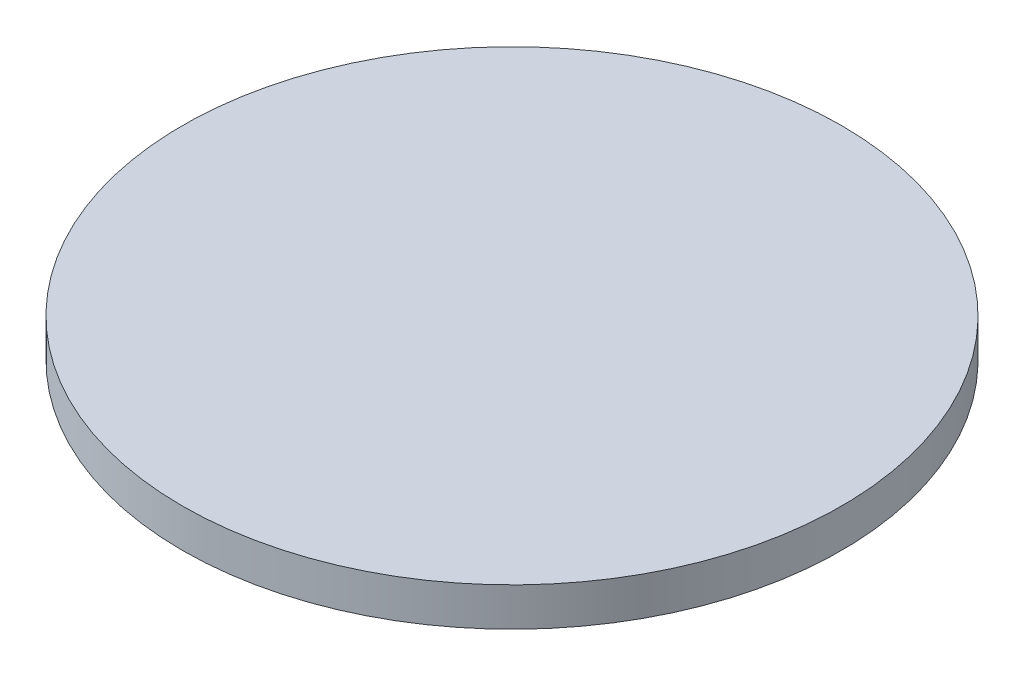
ISO-10303-21;
HEADER;
FILE_DESCRIPTION(('STEP AP214'),'2;1');
FILE_NAME('part.step','',(''),(''),'','','');
FILE_SCHEMA(('AUTOMOTIVE_DESIGN { 1 0 10303 214 1 1 1 1 }'));
ENDSEC;
DATA;
#1=APPLICATION_CONTEXT('core data for automotive mechanical design processes');
#2=APPLICATION_PROTOCOL_DEFINITION('international standard','automotive_design',2000,#1);
#3=PRODUCT_CONTEXT('',#1,'mechanical');
#4=PRODUCT('Part','Part','',(#3));
#5=PRODUCT_RELATED_PRODUCT_CATEGORY('part','',(#4));
#6=PRODUCT_DEFINITION_FORMATION('','',#4);
#7=PRODUCT_DEFINITION_CONTEXT('part definition',#1,'design');
#8=PRODUCT_DEFINITION('design','',#6,#7);
#9=PRODUCT_DEFINITION_SHAPE('','',#8);
#10=(LENGTH_UNIT() NAMED_UNIT(*) SI_UNIT(.MILLI.,.METRE.));
#11=(NAMED_UNIT(*) PLANE_ANGLE_UNIT() SI_UNIT($,.RADIAN.));
#12=(NAMED_UNIT(*) SI_UNIT($,.STERADIAN.) SOLID_ANGLE_UNIT());
#13=UNCERTAINTY_MEASURE_WITH_UNIT(LENGTH_MEASURE(1.E-05),#10,'distance_accuracy_value','');
#14=(GEOMETRIC_REPRESENTATION_CONTEXT(3) GLOBAL_UNCERTAINTY_ASSIGNED_CONTEXT((#13)) GLOBAL_UNIT_ASSIGNED_CONTEXT((#10,
#11,#12)) REPRESENTATION_CONTEXT('',''));
#15=CARTESIAN_POINT('',(0.,0.,0.));
#16=DIRECTION('',(0.,0.,1.));
#17=DIRECTION('',(1.,0.,0.));
#18=AXIS2_PLACEMENT_3D('',#15,#16,#17);
#19=CARTESIAN_POINT('',(0.,7.,0.));
#20=DIRECTION('',(0.,-1.,0.));
#21=DIRECTION('',(0.,0.,-1.));
#22=AXIS2_PLACEMENT_3D('',#19,#20,#21);
#23=CYLINDRICAL_SURFACE('',#22,60.);
#24=CARTESIAN_POINT('',(0.,7.,0.));
#25=DIRECTION('',(0.,1.,0.));
#26=DIRECTION('',(0.,0.,1.));
#27=AXIS2_PLACEMENT_3D('',#24,#25,#26);
#28=CIRCLE('',#27,60.);
#29=CARTESIAN_POINT('',(0.,7.,60.));
#30=VERTEX_POINT('',#29);
#31=EDGE_CURVE('E10',#30,#30,#28,.T.);
#32=ORIENTED_EDGE('',*,*,#31,.F.);
#33=EDGE_LOOP('',(#32));
#34=FACE_BOUND('',#33,.T.);
#35=CARTESIAN_POINT('',(0.,0.,0.));
#36=DIRECTION('',(0.,1.,0.));
#37=DIRECTION('',(0.,0.,1.));
#38=AXIS2_PLACEMENT_3D('',#35,#36,#37);
#39=CIRCLE('',#38,60.);
#40=CARTESIAN_POINT('',(0.,0.,60.));
#41=VERTEX_POINT('',#40);
#42=EDGE_CURVE('E33',#41,#41,#39,.T.);
#43=ORIENTED_EDGE('',*,*,#42,.T.);
#44=EDGE_LOOP('',(#43));
#45=FACE_BOUND('',#44,.T.);
#46=ADVANCED_FACE('F30',(#34,#45),#23,.T.);
#47=CARTESIAN_POINT('',(0.,7.,0.));
#48=DIRECTION('',(0.,1.,0.));
#49=DIRECTION('',(0.,0.,1.));
#50=AXIS2_PLACEMENT_3D('',#47,#48,#49);
#51=PLANE('',#50);
#52=ORIENTED_EDGE('',*,*,#31,.T.);
#53=EDGE_LOOP('',(#52));
#54=FACE_BOUND('',#53,.T.);
#55=ADVANCED_FACE('F45',(#54),#51,.T.);
#56=CARTESIAN_POINT('',(0.,0.,0.));
#57=DIRECTION('',(0.,1.,0.));
#58=DIRECTION('',(0.,0.,1.));
#59=AXIS2_PLACEMENT_3D('',#56,#57,#58);
#60=PLANE('',#59);
#61=ORIENTED_EDGE('',*,*,#42,.F.);
#62=EDGE_LOOP('',(#61));
#63=FACE_BOUND('',#62,.T.);
#64=ADVANCED_FACE('F43',(#63),#60,.F.);
#65=CLOSED_SHELL('',(#46,#55,#64));
#66=MANIFOLD_SOLID_BREP('B2',#65);
#67=ADVANCED_BREP_SHAPE_REPRESENTATION('',(#18,#66),#14);
#68=SHAPE_DEFINITION_REPRESENTATION(#9,#67);
ENDSEC;
END-ISO-10303-21;
